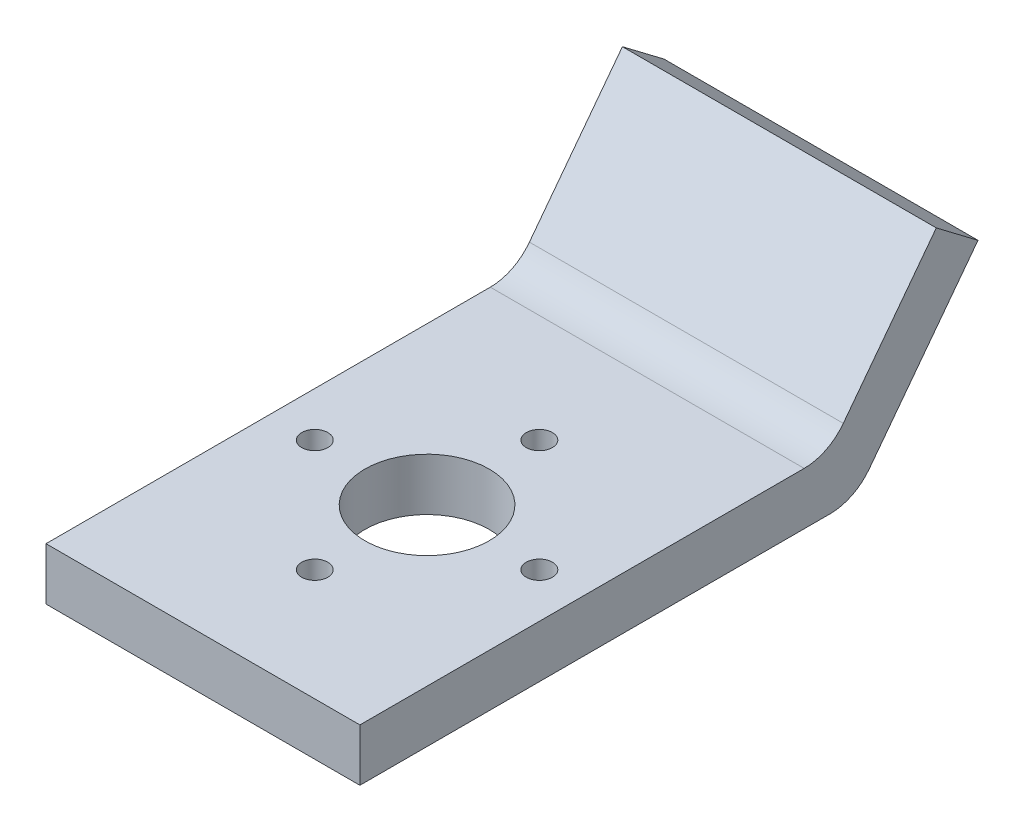
ISO-10303-21;
HEADER;
FILE_DESCRIPTION(('STEP AP214'),'2;1');
FILE_NAME('part.step','',(''),(''),'','','');
FILE_SCHEMA(('AUTOMOTIVE_DESIGN { 1 0 10303 214 1 1 1 1 }'));
ENDSEC;
DATA;
#1=APPLICATION_CONTEXT('core data for automotive mechanical design processes');
#2=APPLICATION_PROTOCOL_DEFINITION('international standard','automotive_design',2000,#1);
#3=PRODUCT_CONTEXT('',#1,'mechanical');
#4=PRODUCT('Part','Part','',(#3));
#5=PRODUCT_RELATED_PRODUCT_CATEGORY('part','',(#4));
#6=PRODUCT_DEFINITION_FORMATION('','',#4);
#7=PRODUCT_DEFINITION_CONTEXT('part definition',#1,'design');
#8=PRODUCT_DEFINITION('design','',#6,#7);
#9=PRODUCT_DEFINITION_SHAPE('','',#8);
#10=(LENGTH_UNIT() NAMED_UNIT(*) SI_UNIT(.MILLI.,.METRE.));
#11=(NAMED_UNIT(*) PLANE_ANGLE_UNIT() SI_UNIT($,.RADIAN.));
#12=(NAMED_UNIT(*) SI_UNIT($,.STERADIAN.) SOLID_ANGLE_UNIT());
#13=UNCERTAINTY_MEASURE_WITH_UNIT(LENGTH_MEASURE(1.E-05),#10,'distance_accuracy_value','');
#14=(GEOMETRIC_REPRESENTATION_CONTEXT(3) GLOBAL_UNCERTAINTY_ASSIGNED_CONTEXT((#13)) GLOBAL_UNIT_ASSIGNED_CONTEXT((#10,
#11,#12)) REPRESENTATION_CONTEXT('',''));
#15=CARTESIAN_POINT('',(0.,0.,0.));
#16=DIRECTION('',(0.,0.,1.));
#17=DIRECTION('',(1.,0.,0.));
#18=AXIS2_PLACEMENT_3D('',#15,#16,#17);
#19=CARTESIAN_POINT('',(-38.1,28.9394708532665,-34.0237396964989));
#20=DIRECTION('',(0.,-1.,0.));
#21=DIRECTION('',(0.,0.,-1.));
#22=AXIS2_PLACEMENT_3D('',#19,#20,#21);
#23=PLANE('',#22);
#24=CARTESIAN_POINT('',(-5.42234568987325,28.9394708532665,-61.2250075726712));
#25=DIRECTION('',(0.,-1.,0.));
#26=DIRECTION('',(0.,0.,-1.));
#27=AXIS2_PLACEMENT_3D('',#24,#25,#26);
#28=CIRCLE('',#27,1.58694807587819);
#29=CARTESIAN_POINT('',(-5.42234568987325,28.9394708532665,-62.8119556485494));
#30=VERTEX_POINT('',#29);
#31=EDGE_CURVE('E172',#30,#30,#28,.F.);
#32=ORIENTED_EDGE('',*,*,#31,.T.);
#33=EDGE_LOOP('',(#32));
#34=FACE_BOUND('',#33,.T.);
#35=CARTESIAN_POINT('',(-32.6776543101267,28.9394708532665,-61.2250075726712));
#36=DIRECTION('',(0.,-1.,0.));
#37=DIRECTION('',(0.,0.,-1.));
#38=AXIS2_PLACEMENT_3D('',#35,#36,#37);
#39=CIRCLE('',#38,1.5869480758782);
#40=CARTESIAN_POINT('',(-32.6776543101267,28.9394708532665,-62.8119556485494));
#41=VERTEX_POINT('',#40);
#42=EDGE_CURVE('E165',#41,#41,#39,.F.);
#43=ORIENTED_EDGE('',*,*,#42,.T.);
#44=EDGE_LOOP('',(#43));
#45=FACE_BOUND('',#44,.T.);
#46=DIRECTION('',(0.,0.,-1.));
#47=VECTOR('',#46,1.);
#48=CARTESIAN_POINT('',(0.,28.9394708532665,-34.0237396964989));
#49=LINE('',#48,#47);
#50=CARTESIAN_POINT('',(0.,28.9394708532665,-34.0237396964989));
#51=VERTEX_POINT('',#50);
#52=CARTESIAN_POINT('',(0.,28.9394708532665,-91.1074885716545));
#53=VERTEX_POINT('',#52);
#54=EDGE_CURVE('E146',#51,#53,#49,.T.);
#55=ORIENTED_EDGE('',*,*,#54,.F.);
#56=DIRECTION('',(1.,0.,0.));
#57=VECTOR('',#56,1.);
#58=CARTESIAN_POINT('',(-38.1,28.9394708532665,-34.0237396964989));
#59=LINE('',#58,#57);
#60=CARTESIAN_POINT('',(-38.1,28.9394708532665,-34.0237396964989));
#61=VERTEX_POINT('',#60);
#62=EDGE_CURVE('E112',#61,#51,#59,.T.);
#63=ORIENTED_EDGE('',*,*,#62,.F.);
#64=DIRECTION('',(0.,0.,-1.));
#65=VECTOR('',#64,1.);
#66=CARTESIAN_POINT('',(-38.1,28.9394708532665,-34.0237396964989));
#67=LINE('',#66,#65);
#68=CARTESIAN_POINT('',(-38.1,28.9394708532665,-91.1074885716545));
#69=VERTEX_POINT('',#68);
#70=EDGE_CURVE('E118',#61,#69,#67,.T.);
#71=ORIENTED_EDGE('',*,*,#70,.T.);
#72=DIRECTION('',(1.,0.,0.));
#73=VECTOR('',#72,1.);
#74=CARTESIAN_POINT('',(-38.1,28.9394708532665,-91.1074885716545));
#75=LINE('',#74,#73);
#76=EDGE_CURVE('E102',#69,#53,#75,.T.);
#77=ORIENTED_EDGE('',*,*,#76,.T.);
#78=EDGE_LOOP('',(#55,#63,#71,#77));
#79=FACE_BOUND('',#78,.T.);
#80=CARTESIAN_POINT('',(-19.05,28.9394708532665,-61.2250075726712));
#81=DIRECTION('',(0.,-1.,0.));
#82=DIRECTION('',(0.,0.,-1.));
#83=AXIS2_PLACEMENT_3D('',#80,#81,#82);
#84=CIRCLE('',#83,7.54356303083551);
#85=CARTESIAN_POINT('',(-19.05,28.9394708532665,-68.7685706035067));
#86=VERTEX_POINT('',#85);
#87=EDGE_CURVE('E134',#86,#86,#84,.F.);
#88=ORIENTED_EDGE('',*,*,#87,.T.);
#89=EDGE_LOOP('',(#88));
#90=FACE_BOUND('',#89,.T.);
#91=CARTESIAN_POINT('',(-19.05,28.9394708532665,-74.8526618827979));
#92=DIRECTION('',(0.,-1.,0.));
#93=DIRECTION('',(0.,0.,-1.));
#94=AXIS2_PLACEMENT_3D('',#91,#92,#93);
#95=CIRCLE('',#94,1.5869480758782);
#96=CARTESIAN_POINT('',(-19.05,28.9394708532665,-76.4396099586761));
#97=VERTEX_POINT('',#96);
#98=EDGE_CURVE('E169',#97,#97,#95,.F.);
#99=ORIENTED_EDGE('',*,*,#98,.T.);
#100=EDGE_LOOP('',(#99));
#101=FACE_BOUND('',#100,.T.);
#102=CARTESIAN_POINT('',(-19.05,28.9394708532665,-47.5973532625444));
#103=DIRECTION('',(0.,-1.,0.));
#104=DIRECTION('',(0.,0.,-1.));
#105=AXIS2_PLACEMENT_3D('',#102,#103,#104);
#106=CIRCLE('',#105,1.5869480758782);
#107=CARTESIAN_POINT('',(-19.05,28.9394708532665,-49.1843013384226));
#108=VERTEX_POINT('',#107);
#109=EDGE_CURVE('E175',#108,#108,#106,.F.);
#110=ORIENTED_EDGE('',*,*,#109,.T.);
#111=EDGE_LOOP('',(#110));
#112=FACE_BOUND('',#111,.T.);
#113=ADVANCED_FACE('F31',(#34,#45,#79,#90,#101,#112),#23,.T.);
#114=CARTESIAN_POINT('',(-38.1,35.2894708532665,-34.0237396964989));
#115=DIRECTION('',(0.,1.,0.));
#116=DIRECTION('',(0.,0.,1.));
#117=AXIS2_PLACEMENT_3D('',#114,#115,#116);
#118=PLANE('',#117);
#119=CARTESIAN_POINT('',(-5.42234568987325,35.2894708532665,-61.2250075726712));
#120=DIRECTION('',(0.,1.,0.));
#121=DIRECTION('',(0.,0.,1.));
#122=AXIS2_PLACEMENT_3D('',#119,#120,#121);
#123=CIRCLE('',#122,1.58694807587819);
#124=CARTESIAN_POINT('',(-5.42234568987325,35.2894708532665,-62.8119556485494));
#125=VERTEX_POINT('',#124);
#126=EDGE_CURVE('E173',#125,#125,#123,.F.);
#127=ORIENTED_EDGE('',*,*,#126,.T.);
#128=EDGE_LOOP('',(#127));
#129=FACE_BOUND('',#128,.T.);
#130=CARTESIAN_POINT('',(-32.6776543101267,35.2894708532665,-61.2250075726712));
#131=DIRECTION('',(0.,1.,0.));
#132=DIRECTION('',(0.,0.,1.));
#133=AXIS2_PLACEMENT_3D('',#130,#131,#132);
#134=CIRCLE('',#133,1.5869480758782);
#135=CARTESIAN_POINT('',(-32.6776543101267,35.2894708532665,-62.8119556485494));
#136=VERTEX_POINT('',#135);
#137=EDGE_CURVE('E166',#136,#136,#134,.F.);
#138=ORIENTED_EDGE('',*,*,#137,.T.);
#139=EDGE_LOOP('',(#138));
#140=FACE_BOUND('',#139,.T.);
#141=DIRECTION('',(0.,0.,1.));
#142=VECTOR('',#141,1.);
#143=CARTESIAN_POINT('',(0.,35.2894708532665,-34.0237396964989));
#144=LINE('',#143,#142);
#145=CARTESIAN_POINT('',(0.,35.2894708532665,-87.9511869365552));
#146=VERTEX_POINT('',#145);
#147=CARTESIAN_POINT('',(0.,35.2894708532665,-34.0237396964989));
#148=VERTEX_POINT('',#147);
#149=EDGE_CURVE('E140',#146,#148,#144,.T.);
#150=ORIENTED_EDGE('',*,*,#149,.F.);
#151=DIRECTION('',(1.,0.,0.));
#152=VECTOR('',#151,1.);
#153=CARTESIAN_POINT('',(-38.1,35.2894708532665,-87.9511869365552));
#154=LINE('',#153,#152);
#155=CARTESIAN_POINT('',(-38.1,35.2894708532665,-87.9511869365552));
#156=VERTEX_POINT('',#155);
#157=EDGE_CURVE('E157',#156,#146,#154,.T.);
#158=ORIENTED_EDGE('',*,*,#157,.F.);
#159=DIRECTION('',(0.,0.,1.));
#160=VECTOR('',#159,1.);
#161=CARTESIAN_POINT('',(-38.1,35.2894708532665,-34.0237396964989));
#162=LINE('',#161,#160);
#163=CARTESIAN_POINT('',(-38.1,35.2894708532665,-34.0237396964989));
#164=VERTEX_POINT('',#163);
#165=EDGE_CURVE('E125',#156,#164,#162,.T.);
#166=ORIENTED_EDGE('',*,*,#165,.T.);
#167=DIRECTION('',(1.,0.,0.));
#168=VECTOR('',#167,1.);
#169=CARTESIAN_POINT('',(-38.1,35.2894708532665,-34.0237396964989));
#170=LINE('',#169,#168);
#171=EDGE_CURVE('E155',#164,#148,#170,.T.);
#172=ORIENTED_EDGE('',*,*,#171,.T.);
#173=EDGE_LOOP('',(#150,#158,#166,#172));
#174=FACE_BOUND('',#173,.T.);
#175=CARTESIAN_POINT('',(-19.05,35.2894708532665,-61.2250075726712));
#176=DIRECTION('',(0.,1.,0.));
#177=DIRECTION('',(0.,0.,1.));
#178=AXIS2_PLACEMENT_3D('',#175,#176,#177);
#179=CIRCLE('',#178,7.54356303083551);
#180=CARTESIAN_POINT('',(-19.05,35.2894708532665,-68.7685706035067));
#181=VERTEX_POINT('',#180);
#182=EDGE_CURVE('E162',#181,#181,#179,.F.);
#183=ORIENTED_EDGE('',*,*,#182,.T.);
#184=EDGE_LOOP('',(#183));
#185=FACE_BOUND('',#184,.T.);
#186=CARTESIAN_POINT('',(-19.05,35.2894708532665,-74.8526618827979));
#187=DIRECTION('',(0.,1.,0.));
#188=DIRECTION('',(0.,0.,1.));
#189=AXIS2_PLACEMENT_3D('',#186,#187,#188);
#190=CIRCLE('',#189,1.5869480758782);
#191=CARTESIAN_POINT('',(-19.05,35.2894708532665,-76.4396099586761));
#192=VERTEX_POINT('',#191);
#193=EDGE_CURVE('E170',#192,#192,#190,.F.);
#194=ORIENTED_EDGE('',*,*,#193,.T.);
#195=EDGE_LOOP('',(#194));
#196=FACE_BOUND('',#195,.T.);
#197=CARTESIAN_POINT('',(-19.05,35.2894708532665,-47.5973532625444));
#198=DIRECTION('',(0.,1.,0.));
#199=DIRECTION('',(0.,0.,1.));
#200=AXIS2_PLACEMENT_3D('',#197,#198,#199);
#201=CIRCLE('',#200,1.5869480758782);
#202=CARTESIAN_POINT('',(-19.05,35.2894708532665,-49.1843013384226));
#203=VERTEX_POINT('',#202);
#204=EDGE_CURVE('E35',#203,#203,#201,.F.);
#205=ORIENTED_EDGE('',*,*,#204,.T.);
#206=EDGE_LOOP('',(#205));
#207=FACE_BOUND('',#206,.T.);
#208=ADVANCED_FACE('F201',(#129,#140,#174,#185,#196,#207),#118,.T.);
#209=CARTESIAN_POINT('',(-38.1,48.7160753374682,-109.047015974455));
#210=DIRECTION('',(0.,0.797160942990067,-0.603766868063483));
#211=DIRECTION('',(0.,0.603766868063483,0.797160942990067));
#212=AXIS2_PLACEMENT_3D('',#209,#210,#211);
#213=PLANE('',#212);
#214=DIRECTION('',(0.,0.603766868063483,0.797160942990067));
#215=VECTOR('',#214,1.);
#216=CARTESIAN_POINT('',(0.,48.7160753374682,-109.047015974455));
#217=LINE('',#216,#215);
#218=CARTESIAN_POINT('',(0.,48.7160753374682,-109.047015974455));
#219=VERTEX_POINT('',#218);
#220=CARTESIAN_POINT('',(0.,52.5499949496713,-103.985043986468));
#221=VERTEX_POINT('',#220);
#222=EDGE_CURVE('E130',#219,#221,#217,.T.);
#223=ORIENTED_EDGE('',*,*,#222,.F.);
#224=DIRECTION('',(1.,0.,0.));
#225=VECTOR('',#224,1.);
#226=CARTESIAN_POINT('',(-38.1,48.7160753374682,-109.047015974455));
#227=LINE('',#226,#225);
#228=CARTESIAN_POINT('',(-38.1,48.7160753374682,-109.047015974455));
#229=VERTEX_POINT('',#228);
#230=EDGE_CURVE('E12',#229,#219,#227,.T.);
#231=ORIENTED_EDGE('',*,*,#230,.F.);
#232=DIRECTION('',(0.,0.603766868063483,0.797160942990067));
#233=VECTOR('',#232,1.);
#234=CARTESIAN_POINT('',(-38.1,48.7160753374682,-109.047015974455));
#235=LINE('',#234,#233);
#236=CARTESIAN_POINT('',(-38.1,52.5499949496713,-103.985043986468));
#237=VERTEX_POINT('',#236);
#238=EDGE_CURVE('E151',#229,#237,#235,.T.);
#239=ORIENTED_EDGE('',*,*,#238,.T.);
#240=DIRECTION('',(1.,0.,0.));
#241=VECTOR('',#240,1.);
#242=CARTESIAN_POINT('',(-38.1,52.5499949496713,-103.985043986468));
#243=LINE('',#242,#241);
#244=EDGE_CURVE('E88',#237,#221,#243,.T.);
#245=ORIENTED_EDGE('',*,*,#244,.T.);
#246=EDGE_LOOP('',(#223,#231,#239,#245));
#247=FACE_BOUND('',#246,.T.);
#248=ADVANCED_FACE('F33',(#247),#213,.T.);
#249=CARTESIAN_POINT('',(-38.1,31.2997028841221,-95.8559173115653));
#250=DIRECTION('',(0.,-0.603766868063483,-0.797160942990067));
#251=DIRECTION('',(0.,0.797160942990067,-0.603766868063483));
#252=AXIS2_PLACEMENT_3D('',#249,#250,#251);
#253=PLANE('',#252);
#254=DIRECTION('',(0.,0.797160942990067,-0.603766868063483));
#255=VECTOR('',#254,1.);
#256=CARTESIAN_POINT('',(0.,31.2997028841221,-95.8559173115653));
#257=LINE('',#256,#255);
#258=CARTESIAN_POINT('',(0.,31.2997028841221,-95.8559173115653));
#259=VERTEX_POINT('',#258);
#260=EDGE_CURVE('E149',#259,#219,#257,.T.);
#261=ORIENTED_EDGE('',*,*,#260,.F.);
#262=DIRECTION('',(1.,0.,0.));
#263=VECTOR('',#262,1.);
#264=CARTESIAN_POINT('',(-38.1,31.2997028841221,-95.8559173115653));
#265=LINE('',#264,#263);
#266=CARTESIAN_POINT('',(-38.1,31.2997028841221,-95.8559173115653));
#267=VERTEX_POINT('',#266);
#268=EDGE_CURVE('E41',#267,#259,#265,.T.);
#269=ORIENTED_EDGE('',*,*,#268,.F.);
#270=DIRECTION('',(0.,0.797160942990067,-0.603766868063483));
#271=VECTOR('',#270,1.);
#272=CARTESIAN_POINT('',(-38.1,31.2997028841221,-95.8559173115653));
#273=LINE('',#272,#271);
#274=EDGE_CURVE('E120',#267,#229,#273,.T.);
#275=ORIENTED_EDGE('',*,*,#274,.T.);
#276=ORIENTED_EDGE('',*,*,#230,.T.);
#277=EDGE_LOOP('',(#261,#269,#275,#276));
#278=FACE_BOUND('',#277,.T.);
#279=ADVANCED_FACE('F211',(#278),#253,.T.);
#280=CARTESIAN_POINT('',(-38.1,34.8961459534037,-91.1074885716545));
#281=DIRECTION('',(1.,0.,0.));
#282=DIRECTION('',(0.,0.,-1.));
#283=AXIS2_PLACEMENT_3D('',#280,#281,#282);
#284=CYLINDRICAL_SURFACE('',#283,5.9566751001372);
#285=CARTESIAN_POINT('',(0.,34.8961459534037,-91.1074885716545));
#286=DIRECTION('',(1.,0.,0.));
#287=DIRECTION('',(0.,0.,-1.));
#288=AXIS2_PLACEMENT_3D('',#285,#286,#287);
#289=CIRCLE('',#288,5.9566751001372);
#290=EDGE_CURVE('E107',#53,#259,#289,.T.);
#291=ORIENTED_EDGE('',*,*,#290,.F.);
#292=ORIENTED_EDGE('',*,*,#76,.F.);
#293=CARTESIAN_POINT('',(-38.1,34.8961459534037,-91.1074885716545));
#294=DIRECTION('',(1.,0.,0.));
#295=DIRECTION('',(0.,0.,-1.));
#296=AXIS2_PLACEMENT_3D('',#293,#294,#295);
#297=CIRCLE('',#296,5.9566751001372);
#298=EDGE_CURVE('E105',#69,#267,#297,.T.);
#299=ORIENTED_EDGE('',*,*,#298,.T.);
#300=ORIENTED_EDGE('',*,*,#268,.T.);
#301=EDGE_LOOP('',(#291,#292,#299,#300));
#302=FACE_BOUND('',#301,.T.);
#303=ADVANCED_FACE('F104',(#302),#284,.T.);
#304=CARTESIAN_POINT('',(-38.1,35.2894708532665,-34.0237396964989));
#305=DIRECTION('',(0.,0.,1.));
#306=DIRECTION('',(0.,-1.,0.));
#307=AXIS2_PLACEMENT_3D('',#304,#305,#306);
#308=PLANE('',#307);
#309=DIRECTION('',(0.,-1.,0.));
#310=VECTOR('',#309,1.);
#311=CARTESIAN_POINT('',(0.,35.2894708532665,-34.0237396964989));
#312=LINE('',#311,#310);
#313=EDGE_CURVE('E143',#148,#51,#312,.T.);
#314=ORIENTED_EDGE('',*,*,#313,.F.);
#315=ORIENTED_EDGE('',*,*,#171,.F.);
#316=DIRECTION('',(0.,-1.,0.));
#317=VECTOR('',#316,1.);
#318=CARTESIAN_POINT('',(-38.1,35.2894708532665,-34.0237396964989));
#319=LINE('',#318,#317);
#320=EDGE_CURVE('E123',#164,#61,#319,.T.);
#321=ORIENTED_EDGE('',*,*,#320,.T.);
#322=ORIENTED_EDGE('',*,*,#62,.T.);
#323=EDGE_LOOP('',(#314,#315,#321,#322));
#324=FACE_BOUND('',#323,.T.);
#325=ADVANCED_FACE('F218',(#324),#308,.T.);
#326=CARTESIAN_POINT('',(-38.1,41.2461459534037,-87.9511869365552));
#327=DIRECTION('',(1.,0.,0.));
#328=DIRECTION('',(0.,0.,-1.));
#329=AXIS2_PLACEMENT_3D('',#326,#327,#328);
#330=CYLINDRICAL_SURFACE('',#329,5.95667510013721);
#331=CARTESIAN_POINT('',(0.,41.2461459534037,-87.9511869365552));
#332=DIRECTION('',(-1.,0.,0.));
#333=DIRECTION('',(0.,0.,-1.));
#334=AXIS2_PLACEMENT_3D('',#331,#332,#333);
#335=CIRCLE('',#334,5.95667510013721);
#336=CARTESIAN_POINT('',(0.,37.6497028841221,-92.699615676466));
#337=VERTEX_POINT('',#336);
#338=EDGE_CURVE('E137',#337,#146,#335,.T.);
#339=ORIENTED_EDGE('',*,*,#338,.F.);
#340=DIRECTION('',(1.,0.,0.));
#341=VECTOR('',#340,1.);
#342=CARTESIAN_POINT('',(-38.1,37.6497028841221,-92.699615676466));
#343=LINE('',#342,#341);
#344=CARTESIAN_POINT('',(-38.1,37.6497028841221,-92.699615676466));
#345=VERTEX_POINT('',#344);
#346=EDGE_CURVE('E159',#345,#337,#343,.T.);
#347=ORIENTED_EDGE('',*,*,#346,.F.);
#348=CARTESIAN_POINT('',(-38.1,41.2461459534037,-87.9511869365552));
#349=DIRECTION('',(-1.,0.,0.));
#350=DIRECTION('',(0.,0.,-1.));
#351=AXIS2_PLACEMENT_3D('',#348,#349,#350);
#352=CIRCLE('',#351,5.95667510013721);
#353=EDGE_CURVE('E195',#345,#156,#352,.T.);
#354=ORIENTED_EDGE('',*,*,#353,.T.);
#355=ORIENTED_EDGE('',*,*,#157,.T.);
#356=EDGE_LOOP('',(#339,#347,#354,#355));
#357=FACE_BOUND('',#356,.T.);
#358=ADVANCED_FACE('F207',(#357),#330,.F.);
#359=CARTESIAN_POINT('',(-38.1,37.6497028841221,-92.699615676466));
#360=DIRECTION('',(0.,0.603766868063482,0.797160942990067));
#361=DIRECTION('',(0.,-0.797160942990067,0.603766868063482));
#362=AXIS2_PLACEMENT_3D('',#359,#360,#361);
#363=PLANE('',#362);
#364=DIRECTION('',(0.,-0.797160942990067,0.603766868063482));
#365=VECTOR('',#364,1.);
#366=CARTESIAN_POINT('',(0.,37.6497028841221,-92.699615676466));
#367=LINE('',#366,#365);
#368=EDGE_CURVE('E133',#221,#337,#367,.T.);
#369=ORIENTED_EDGE('',*,*,#368,.F.);
#370=ORIENTED_EDGE('',*,*,#244,.F.);
#371=DIRECTION('',(0.,-0.797160942990067,0.603766868063482));
#372=VECTOR('',#371,1.);
#373=CARTESIAN_POINT('',(-38.1,37.6497028841221,-92.699615676466));
#374=LINE('',#373,#372);
#375=EDGE_CURVE('E193',#237,#345,#374,.T.);
#376=ORIENTED_EDGE('',*,*,#375,.T.);
#377=ORIENTED_EDGE('',*,*,#346,.T.);
#378=EDGE_LOOP('',(#369,#370,#376,#377));
#379=FACE_BOUND('',#378,.T.);
#380=ADVANCED_FACE('F208',(#379),#363,.T.);
#381=CARTESIAN_POINT('',(-38.1,41.2461459534037,-87.9511869365552));
#382=DIRECTION('',(1.,0.,0.));
#383=DIRECTION('',(0.,0.,-1.));
#384=AXIS2_PLACEMENT_3D('',#381,#382,#383);
#385=PLANE('',#384);
#386=ORIENTED_EDGE('',*,*,#238,.F.);
#387=ORIENTED_EDGE('',*,*,#274,.F.);
#388=ORIENTED_EDGE('',*,*,#298,.F.);
#389=ORIENTED_EDGE('',*,*,#70,.F.);
#390=ORIENTED_EDGE('',*,*,#320,.F.);
#391=ORIENTED_EDGE('',*,*,#165,.F.);
#392=ORIENTED_EDGE('',*,*,#353,.F.);
#393=ORIENTED_EDGE('',*,*,#375,.F.);
#394=EDGE_LOOP('',(#386,#387,#388,#389,#390,#391,#392,#393));
#395=FACE_BOUND('',#394,.T.);
#396=ADVANCED_FACE('F116',(#395),#385,.F.);
#397=CARTESIAN_POINT('',(0.,41.2461459534037,-87.9511869365552));
#398=DIRECTION('',(1.,0.,0.));
#399=DIRECTION('',(0.,0.,-1.));
#400=AXIS2_PLACEMENT_3D('',#397,#398,#399);
#401=PLANE('',#400);
#402=ORIENTED_EDGE('',*,*,#222,.T.);
#403=ORIENTED_EDGE('',*,*,#368,.T.);
#404=ORIENTED_EDGE('',*,*,#338,.T.);
#405=ORIENTED_EDGE('',*,*,#149,.T.);
#406=ORIENTED_EDGE('',*,*,#313,.T.);
#407=ORIENTED_EDGE('',*,*,#54,.T.);
#408=ORIENTED_EDGE('',*,*,#290,.T.);
#409=ORIENTED_EDGE('',*,*,#260,.T.);
#410=EDGE_LOOP('',(#402,#403,#404,#405,#406,#407,#408,#409));
#411=FACE_BOUND('',#410,.T.);
#412=ADVANCED_FACE('F210',(#411),#401,.T.);
#413=CARTESIAN_POINT('',(-19.05,38.1,-61.2250075726712));
#414=DIRECTION('',(0.,-1.,0.));
#415=DIRECTION('',(0.,0.,-1.));
#416=AXIS2_PLACEMENT_3D('',#413,#414,#415);
#417=CYLINDRICAL_SURFACE('',#416,7.54356303083551);
#418=CARTESIAN_POINT('',(-19.05,28.9394708532665,-68.7685706035067));
#419=CARTESIAN_POINT('',(-19.05,29.0056166865998,-68.7685706035067));
#420=CARTESIAN_POINT('',(-19.05,29.0717625199332,-68.7685706035067));
#421=CARTESIAN_POINT('',(-19.05,29.2040541865998,-68.7685706035067));
#422=CARTESIAN_POINT('',(-19.05,29.2702000199332,-68.7685706035067));
#423=CARTESIAN_POINT('',(-19.05,29.4024916865998,-68.7685706035067));
#424=CARTESIAN_POINT('',(-19.05,29.4686375199332,-68.7685706035067));
#425=CARTESIAN_POINT('',(-19.05,29.6009291865998,-68.7685706035067));
#426=CARTESIAN_POINT('',(-19.05,29.6670750199332,-68.7685706035067));
#427=CARTESIAN_POINT('',(-19.05,29.7993666865998,-68.7685706035067));
#428=CARTESIAN_POINT('',(-19.05,29.8655125199332,-68.7685706035067));
#429=CARTESIAN_POINT('',(-19.05,29.9978041865998,-68.7685706035067));
#430=CARTESIAN_POINT('',(-19.05,30.0639500199332,-68.7685706035067));
#431=CARTESIAN_POINT('',(-19.05,30.1962416865998,-68.7685706035067));
#432=CARTESIAN_POINT('',(-19.05,30.2623875199332,-68.7685706035067));
#433=CARTESIAN_POINT('',(-19.05,30.3946791865998,-68.7685706035067));
#434=CARTESIAN_POINT('',(-19.05,30.4608250199332,-68.7685706035067));
#435=CARTESIAN_POINT('',(-19.05,30.5931166865998,-68.7685706035067));
#436=CARTESIAN_POINT('',(-19.05,30.6592625199332,-68.7685706035067));
#437=CARTESIAN_POINT('',(-19.05,30.7915541865998,-68.7685706035067));
#438=CARTESIAN_POINT('',(-19.05,30.8577000199332,-68.7685706035067));
#439=CARTESIAN_POINT('',(-19.05,30.9899916865998,-68.7685706035067));
#440=CARTESIAN_POINT('',(-19.05,31.0561375199332,-68.7685706035067));
#441=CARTESIAN_POINT('',(-19.05,31.1884291865998,-68.7685706035067));
#442=CARTESIAN_POINT('',(-19.05,31.2545750199332,-68.7685706035067));
#443=CARTESIAN_POINT('',(-19.05,31.3868666865998,-68.7685706035067));
#444=CARTESIAN_POINT('',(-19.05,31.4530125199332,-68.7685706035067));
#445=CARTESIAN_POINT('',(-19.05,31.5853041865998,-68.7685706035067));
#446=CARTESIAN_POINT('',(-19.05,31.6514500199332,-68.7685706035067));
#447=CARTESIAN_POINT('',(-19.05,31.7837416865998,-68.7685706035067));
#448=CARTESIAN_POINT('',(-19.05,31.8498875199332,-68.7685706035067));
#449=CARTESIAN_POINT('',(-19.05,31.9821791865998,-68.7685706035067));
#450=CARTESIAN_POINT('',(-19.05,32.0483250199332,-68.7685706035067));
#451=CARTESIAN_POINT('',(-19.05,32.1806166865998,-68.7685706035067));
#452=CARTESIAN_POINT('',(-19.05,32.2467625199332,-68.7685706035067));
#453=CARTESIAN_POINT('',(-19.05,32.3790541865998,-68.7685706035067));
#454=CARTESIAN_POINT('',(-19.05,32.4452000199332,-68.7685706035067));
#455=CARTESIAN_POINT('',(-19.05,32.5774916865998,-68.7685706035067));
#456=CARTESIAN_POINT('',(-19.05,32.6436375199332,-68.7685706035067));
#457=CARTESIAN_POINT('',(-19.05,32.7759291865998,-68.7685706035067));
#458=CARTESIAN_POINT('',(-19.05,32.8420750199332,-68.7685706035067));
#459=CARTESIAN_POINT('',(-19.05,32.9743666865998,-68.7685706035067));
#460=CARTESIAN_POINT('',(-19.05,33.0405125199332,-68.7685706035067));
#461=CARTESIAN_POINT('',(-19.05,33.1728041865998,-68.7685706035067));
#462=CARTESIAN_POINT('',(-19.05,33.2389500199332,-68.7685706035067));
#463=CARTESIAN_POINT('',(-19.05,33.3712416865998,-68.7685706035067));
#464=CARTESIAN_POINT('',(-19.05,33.4373875199332,-68.7685706035067));
#465=CARTESIAN_POINT('',(-19.05,33.5696791865998,-68.7685706035067));
#466=CARTESIAN_POINT('',(-19.05,33.6358250199332,-68.7685706035067));
#467=CARTESIAN_POINT('',(-19.05,33.7681166865998,-68.7685706035067));
#468=CARTESIAN_POINT('',(-19.05,33.8342625199332,-68.7685706035067));
#469=CARTESIAN_POINT('',(-19.05,33.9665541865998,-68.7685706035067));
#470=CARTESIAN_POINT('',(-19.05,34.0327000199332,-68.7685706035067));
#471=CARTESIAN_POINT('',(-19.05,34.1649916865998,-68.7685706035067));
#472=CARTESIAN_POINT('',(-19.05,34.2311375199332,-68.7685706035067));
#473=CARTESIAN_POINT('',(-19.05,34.3634291865998,-68.7685706035067));
#474=CARTESIAN_POINT('',(-19.05,34.4295750199332,-68.7685706035067));
#475=CARTESIAN_POINT('',(-19.05,34.5618666865998,-68.7685706035067));
#476=CARTESIAN_POINT('',(-19.05,34.6280125199332,-68.7685706035067));
#477=CARTESIAN_POINT('',(-19.05,34.7603041865998,-68.7685706035067));
#478=CARTESIAN_POINT('',(-19.05,34.8264500199332,-68.7685706035067));
#479=CARTESIAN_POINT('',(-19.05,34.9587416865998,-68.7685706035067));
#480=CARTESIAN_POINT('',(-19.05,35.0248875199332,-68.7685706035067));
#481=CARTESIAN_POINT('',(-19.05,35.1571791865998,-68.7685706035067));
#482=CARTESIAN_POINT('',(-19.05,35.2233250199332,-68.7685706035067));
#483=CARTESIAN_POINT('',(-19.05,35.2894708532665,-68.7685706035067));
#484=B_SPLINE_CURVE_WITH_KNOTS('',3,(#418,#419,#420,#421,#422,#423,#424,#425,#426,#427,#428,
#429,#430,#431,#432,#433,#434,#435,#436,#437,#438,#439,#440,#441,#442,#443,#444,#445,#446,#447,
#448,#449,#450,#451,#452,#453,#454,#455,#456,#457,#458,#459,#460,#461,#462,#463,#464,#465,#466,
#467,#468,#469,#470,#471,#472,#473,#474,#475,#476,#477,#478,#479,#480,#481,#482,#483),
.UNSPECIFIED.,.F.,.F.,(4,2,2,2,2,2,2,2,2,2,2,2,2,2,2,2,2,2,2,2,2,2,2,2,2,2,2,2,2,2,2,2,4),(0.,
0.198437500000002,0.396875000000001,0.5953125,0.793750000000003,0.992187500000002,1.190625,
1.3890625,1.5875,1.7859375,1.984375,2.1828125,2.38125,2.5796875,2.778125,2.9765625,3.175,
3.3734375,3.571875,3.7703125,3.96875,4.1671875,4.365625,4.5640625,4.7625,4.9609375,5.159375,
5.3578125,5.55625,5.7546875,5.953125,6.1515625,6.35),.UNSPECIFIED.);
#485=EDGE_CURVE('BSEAM242',#86,#181,#484,.T.);
#486=ORIENTED_EDGE('',*,*,#87,.F.);
#487=ORIENTED_EDGE('',*,*,#182,.F.);
#488=ORIENTED_EDGE('',*,*,#485,.T.);
#489=ORIENTED_EDGE('',*,*,#485,.F.);
#490=EDGE_LOOP('',(#486,#488,#487,#489));
#491=FACE_BOUND('',#490,.T.);
#492=ADVANCED_FACE('F242',(#491),#417,.F.);
#493=CARTESIAN_POINT('',(-32.6776543101267,38.1,-61.2250075726712));
#494=DIRECTION('',(0.,-1.,0.));
#495=DIRECTION('',(0.,0.,-1.));
#496=AXIS2_PLACEMENT_3D('',#493,#494,#495);
#497=CYLINDRICAL_SURFACE('',#496,1.5869480758782);
#498=CARTESIAN_POINT('',(-32.6776543101267,28.9394708532665,-62.8119556485494));
#499=CARTESIAN_POINT('',(-32.6776543101267,29.0056166865998,-62.8119556485494));
#500=CARTESIAN_POINT('',(-32.6776543101267,29.0717625199332,-62.8119556485494));
#501=CARTESIAN_POINT('',(-32.6776543101267,29.2040541865998,-62.8119556485494));
#502=CARTESIAN_POINT('',(-32.6776543101267,29.2702000199332,-62.8119556485494));
#503=CARTESIAN_POINT('',(-32.6776543101267,29.4024916865998,-62.8119556485494));
#504=CARTESIAN_POINT('',(-32.6776543101267,29.4686375199332,-62.8119556485494));
#505=CARTESIAN_POINT('',(-32.6776543101267,29.6009291865998,-62.8119556485494));
#506=CARTESIAN_POINT('',(-32.6776543101267,29.6670750199332,-62.8119556485494));
#507=CARTESIAN_POINT('',(-32.6776543101267,29.7993666865998,-62.8119556485494));
#508=CARTESIAN_POINT('',(-32.6776543101267,29.8655125199332,-62.8119556485494));
#509=CARTESIAN_POINT('',(-32.6776543101267,29.9978041865998,-62.8119556485494));
#510=CARTESIAN_POINT('',(-32.6776543101267,30.0639500199332,-62.8119556485494));
#511=CARTESIAN_POINT('',(-32.6776543101267,30.1962416865998,-62.8119556485494));
#512=CARTESIAN_POINT('',(-32.6776543101267,30.2623875199332,-62.8119556485494));
#513=CARTESIAN_POINT('',(-32.6776543101267,30.3946791865998,-62.8119556485494));
#514=CARTESIAN_POINT('',(-32.6776543101267,30.4608250199332,-62.8119556485494));
#515=CARTESIAN_POINT('',(-32.6776543101267,30.5931166865998,-62.8119556485494));
#516=CARTESIAN_POINT('',(-32.6776543101267,30.6592625199332,-62.8119556485494));
#517=CARTESIAN_POINT('',(-32.6776543101267,30.7915541865998,-62.8119556485494));
#518=CARTESIAN_POINT('',(-32.6776543101267,30.8577000199332,-62.8119556485494));
#519=CARTESIAN_POINT('',(-32.6776543101267,30.9899916865998,-62.8119556485494));
#520=CARTESIAN_POINT('',(-32.6776543101267,31.0561375199332,-62.8119556485494));
#521=CARTESIAN_POINT('',(-32.6776543101267,31.1884291865998,-62.8119556485494));
#522=CARTESIAN_POINT('',(-32.6776543101267,31.2545750199332,-62.8119556485494));
#523=CARTESIAN_POINT('',(-32.6776543101267,31.3868666865998,-62.8119556485494));
#524=CARTESIAN_POINT('',(-32.6776543101267,31.4530125199332,-62.8119556485494));
#525=CARTESIAN_POINT('',(-32.6776543101267,31.5853041865998,-62.8119556485494));
#526=CARTESIAN_POINT('',(-32.6776543101267,31.6514500199332,-62.8119556485494));
#527=CARTESIAN_POINT('',(-32.6776543101267,31.7837416865998,-62.8119556485494));
#528=CARTESIAN_POINT('',(-32.6776543101267,31.8498875199332,-62.8119556485494));
#529=CARTESIAN_POINT('',(-32.6776543101267,31.9821791865998,-62.8119556485494));
#530=CARTESIAN_POINT('',(-32.6776543101267,32.0483250199332,-62.8119556485494));
#531=CARTESIAN_POINT('',(-32.6776543101267,32.1806166865998,-62.8119556485494));
#532=CARTESIAN_POINT('',(-32.6776543101267,32.2467625199332,-62.8119556485494));
#533=CARTESIAN_POINT('',(-32.6776543101267,32.3790541865998,-62.8119556485494));
#534=CARTESIAN_POINT('',(-32.6776543101267,32.4452000199332,-62.8119556485494));
#535=CARTESIAN_POINT('',(-32.6776543101267,32.5774916865998,-62.8119556485494));
#536=CARTESIAN_POINT('',(-32.6776543101267,32.6436375199332,-62.8119556485494));
#537=CARTESIAN_POINT('',(-32.6776543101267,32.7759291865998,-62.8119556485494));
#538=CARTESIAN_POINT('',(-32.6776543101267,32.8420750199332,-62.8119556485494));
#539=CARTESIAN_POINT('',(-32.6776543101267,32.9743666865998,-62.8119556485494));
#540=CARTESIAN_POINT('',(-32.6776543101267,33.0405125199332,-62.8119556485494));
#541=CARTESIAN_POINT('',(-32.6776543101267,33.1728041865998,-62.8119556485494));
#542=CARTESIAN_POINT('',(-32.6776543101267,33.2389500199332,-62.8119556485494));
#543=CARTESIAN_POINT('',(-32.6776543101267,33.3712416865998,-62.8119556485494));
#544=CARTESIAN_POINT('',(-32.6776543101267,33.4373875199332,-62.8119556485494));
#545=CARTESIAN_POINT('',(-32.6776543101267,33.5696791865998,-62.8119556485494));
#546=CARTESIAN_POINT('',(-32.6776543101267,33.6358250199332,-62.8119556485494));
#547=CARTESIAN_POINT('',(-32.6776543101267,33.7681166865998,-62.8119556485494));
#548=CARTESIAN_POINT('',(-32.6776543101267,33.8342625199332,-62.8119556485494));
#549=CARTESIAN_POINT('',(-32.6776543101267,33.9665541865998,-62.8119556485494));
#550=CARTESIAN_POINT('',(-32.6776543101267,34.0327000199332,-62.8119556485494));
#551=CARTESIAN_POINT('',(-32.6776543101267,34.1649916865998,-62.8119556485494));
#552=CARTESIAN_POINT('',(-32.6776543101267,34.2311375199332,-62.8119556485494));
#553=CARTESIAN_POINT('',(-32.6776543101267,34.3634291865998,-62.8119556485494));
#554=CARTESIAN_POINT('',(-32.6776543101267,34.4295750199332,-62.8119556485494));
#555=CARTESIAN_POINT('',(-32.6776543101267,34.5618666865998,-62.8119556485494));
#556=CARTESIAN_POINT('',(-32.6776543101267,34.6280125199332,-62.8119556485494));
#557=CARTESIAN_POINT('',(-32.6776543101267,34.7603041865998,-62.8119556485494));
#558=CARTESIAN_POINT('',(-32.6776543101267,34.8264500199332,-62.8119556485494));
#559=CARTESIAN_POINT('',(-32.6776543101267,34.9587416865998,-62.8119556485494));
#560=CARTESIAN_POINT('',(-32.6776543101267,35.0248875199332,-62.8119556485494));
#561=CARTESIAN_POINT('',(-32.6776543101267,35.1571791865998,-62.8119556485494));
#562=CARTESIAN_POINT('',(-32.6776543101267,35.2233250199332,-62.8119556485494));
#563=CARTESIAN_POINT('',(-32.6776543101267,35.2894708532665,-62.8119556485494));
#564=B_SPLINE_CURVE_WITH_KNOTS('',3,(#498,#499,#500,#501,#502,#503,#504,#505,#506,#507,#508,
#509,#510,#511,#512,#513,#514,#515,#516,#517,#518,#519,#520,#521,#522,#523,#524,#525,#526,#527,
#528,#529,#530,#531,#532,#533,#534,#535,#536,#537,#538,#539,#540,#541,#542,#543,#544,#545,#546,
#547,#548,#549,#550,#551,#552,#553,#554,#555,#556,#557,#558,#559,#560,#561,#562,#563),
.UNSPECIFIED.,.F.,.F.,(4,2,2,2,2,2,2,2,2,2,2,2,2,2,2,2,2,2,2,2,2,2,2,2,2,2,2,2,2,2,2,2,4),(0.,
0.198437500000002,0.396875000000001,0.5953125,0.793750000000003,0.992187500000002,1.190625,
1.3890625,1.5875,1.7859375,1.984375,2.1828125,2.38125,2.5796875,2.778125,2.9765625,3.175,
3.3734375,3.571875,3.7703125,3.96875,4.1671875,4.365625,4.5640625,4.7625,4.9609375,5.159375,
5.3578125,5.55625,5.7546875,5.953125,6.1515625,6.35),.UNSPECIFIED.);
#565=EDGE_CURVE('BSEAM246',#41,#136,#564,.T.);
#566=ORIENTED_EDGE('',*,*,#42,.F.);
#567=ORIENTED_EDGE('',*,*,#137,.F.);
#568=ORIENTED_EDGE('',*,*,#565,.T.);
#569=ORIENTED_EDGE('',*,*,#565,.F.);
#570=EDGE_LOOP('',(#566,#568,#567,#569));
#571=FACE_BOUND('',#570,.T.);
#572=ADVANCED_FACE('F246',(#571),#497,.F.);
#573=CARTESIAN_POINT('',(-19.05,38.1,-74.8526618827979));
#574=DIRECTION('',(0.,-1.,0.));
#575=DIRECTION('',(0.,0.,-1.));
#576=AXIS2_PLACEMENT_3D('',#573,#574,#575);
#577=CYLINDRICAL_SURFACE('',#576,1.5869480758782);
#578=CARTESIAN_POINT('',(-19.05,28.9394708532665,-76.4396099586761));
#579=CARTESIAN_POINT('',(-19.05,29.0056166865998,-76.4396099586761));
#580=CARTESIAN_POINT('',(-19.05,29.0717625199332,-76.4396099586761));
#581=CARTESIAN_POINT('',(-19.05,29.2040541865998,-76.4396099586761));
#582=CARTESIAN_POINT('',(-19.05,29.2702000199332,-76.4396099586761));
#583=CARTESIAN_POINT('',(-19.05,29.4024916865998,-76.4396099586761));
#584=CARTESIAN_POINT('',(-19.05,29.4686375199332,-76.4396099586761));
#585=CARTESIAN_POINT('',(-19.05,29.6009291865998,-76.4396099586761));
#586=CARTESIAN_POINT('',(-19.05,29.6670750199332,-76.4396099586761));
#587=CARTESIAN_POINT('',(-19.05,29.7993666865998,-76.4396099586761));
#588=CARTESIAN_POINT('',(-19.05,29.8655125199332,-76.4396099586761));
#589=CARTESIAN_POINT('',(-19.05,29.9978041865998,-76.4396099586761));
#590=CARTESIAN_POINT('',(-19.05,30.0639500199332,-76.4396099586761));
#591=CARTESIAN_POINT('',(-19.05,30.1962416865998,-76.4396099586761));
#592=CARTESIAN_POINT('',(-19.05,30.2623875199332,-76.4396099586761));
#593=CARTESIAN_POINT('',(-19.05,30.3946791865998,-76.4396099586761));
#594=CARTESIAN_POINT('',(-19.05,30.4608250199332,-76.4396099586761));
#595=CARTESIAN_POINT('',(-19.05,30.5931166865998,-76.4396099586761));
#596=CARTESIAN_POINT('',(-19.05,30.6592625199332,-76.4396099586761));
#597=CARTESIAN_POINT('',(-19.05,30.7915541865998,-76.4396099586761));
#598=CARTESIAN_POINT('',(-19.05,30.8577000199332,-76.4396099586761));
#599=CARTESIAN_POINT('',(-19.05,30.9899916865998,-76.4396099586761));
#600=CARTESIAN_POINT('',(-19.05,31.0561375199332,-76.4396099586761));
#601=CARTESIAN_POINT('',(-19.05,31.1884291865998,-76.4396099586761));
#602=CARTESIAN_POINT('',(-19.05,31.2545750199332,-76.4396099586761));
#603=CARTESIAN_POINT('',(-19.05,31.3868666865998,-76.4396099586761));
#604=CARTESIAN_POINT('',(-19.05,31.4530125199332,-76.4396099586761));
#605=CARTESIAN_POINT('',(-19.05,31.5853041865998,-76.4396099586761));
#606=CARTESIAN_POINT('',(-19.05,31.6514500199332,-76.4396099586761));
#607=CARTESIAN_POINT('',(-19.05,31.7837416865998,-76.4396099586761));
#608=CARTESIAN_POINT('',(-19.05,31.8498875199332,-76.4396099586761));
#609=CARTESIAN_POINT('',(-19.05,31.9821791865998,-76.4396099586761));
#610=CARTESIAN_POINT('',(-19.05,32.0483250199332,-76.4396099586761));
#611=CARTESIAN_POINT('',(-19.05,32.1806166865998,-76.4396099586761));
#612=CARTESIAN_POINT('',(-19.05,32.2467625199332,-76.4396099586761));
#613=CARTESIAN_POINT('',(-19.05,32.3790541865998,-76.4396099586761));
#614=CARTESIAN_POINT('',(-19.05,32.4452000199332,-76.4396099586761));
#615=CARTESIAN_POINT('',(-19.05,32.5774916865998,-76.4396099586761));
#616=CARTESIAN_POINT('',(-19.05,32.6436375199332,-76.4396099586761));
#617=CARTESIAN_POINT('',(-19.05,32.7759291865998,-76.4396099586761));
#618=CARTESIAN_POINT('',(-19.05,32.8420750199332,-76.4396099586761));
#619=CARTESIAN_POINT('',(-19.05,32.9743666865998,-76.4396099586761));
#620=CARTESIAN_POINT('',(-19.05,33.0405125199332,-76.4396099586761));
#621=CARTESIAN_POINT('',(-19.05,33.1728041865998,-76.4396099586761));
#622=CARTESIAN_POINT('',(-19.05,33.2389500199332,-76.4396099586761));
#623=CARTESIAN_POINT('',(-19.05,33.3712416865998,-76.4396099586761));
#624=CARTESIAN_POINT('',(-19.05,33.4373875199332,-76.4396099586761));
#625=CARTESIAN_POINT('',(-19.05,33.5696791865998,-76.4396099586761));
#626=CARTESIAN_POINT('',(-19.05,33.6358250199332,-76.4396099586761));
#627=CARTESIAN_POINT('',(-19.05,33.7681166865998,-76.4396099586761));
#628=CARTESIAN_POINT('',(-19.05,33.8342625199332,-76.4396099586761));
#629=CARTESIAN_POINT('',(-19.05,33.9665541865998,-76.4396099586761));
#630=CARTESIAN_POINT('',(-19.05,34.0327000199332,-76.4396099586761));
#631=CARTESIAN_POINT('',(-19.05,34.1649916865998,-76.4396099586761));
#632=CARTESIAN_POINT('',(-19.05,34.2311375199332,-76.4396099586761));
#633=CARTESIAN_POINT('',(-19.05,34.3634291865998,-76.4396099586761));
#634=CARTESIAN_POINT('',(-19.05,34.4295750199332,-76.4396099586761));
#635=CARTESIAN_POINT('',(-19.05,34.5618666865998,-76.4396099586761));
#636=CARTESIAN_POINT('',(-19.05,34.6280125199332,-76.4396099586761));
#637=CARTESIAN_POINT('',(-19.05,34.7603041865998,-76.4396099586761));
#638=CARTESIAN_POINT('',(-19.05,34.8264500199332,-76.4396099586761));
#639=CARTESIAN_POINT('',(-19.05,34.9587416865998,-76.4396099586761));
#640=CARTESIAN_POINT('',(-19.05,35.0248875199332,-76.4396099586761));
#641=CARTESIAN_POINT('',(-19.05,35.1571791865998,-76.4396099586761));
#642=CARTESIAN_POINT('',(-19.05,35.2233250199332,-76.4396099586761));
#643=CARTESIAN_POINT('',(-19.05,35.2894708532665,-76.4396099586761));
#644=B_SPLINE_CURVE_WITH_KNOTS('',3,(#578,#579,#580,#581,#582,#583,#584,#585,#586,#587,#588,
#589,#590,#591,#592,#593,#594,#595,#596,#597,#598,#599,#600,#601,#602,#603,#604,#605,#606,#607,
#608,#609,#610,#611,#612,#613,#614,#615,#616,#617,#618,#619,#620,#621,#622,#623,#624,#625,#626,
#627,#628,#629,#630,#631,#632,#633,#634,#635,#636,#637,#638,#639,#640,#641,#642,#643),
.UNSPECIFIED.,.F.,.F.,(4,2,2,2,2,2,2,2,2,2,2,2,2,2,2,2,2,2,2,2,2,2,2,2,2,2,2,2,2,2,2,2,4),(0.,
0.198437500000002,0.396875000000001,0.5953125,0.793750000000003,0.992187499999998,1.190625,
1.3890625,1.5875,1.7859375,1.984375,2.1828125,2.38124999999999,2.5796875,2.778125,
2.97656249999999,3.175,3.37343749999999,3.571875,3.7703125,3.96874999999999,4.1671875,4.365625,
4.56406249999999,4.7625,4.96093749999999,5.15937499999999,5.35781249999999,5.55624999999999,
5.75468749999999,5.95312499999999,6.15156249999999,6.34999999999999),.UNSPECIFIED.);
#645=EDGE_CURVE('BSEAM250',#97,#192,#644,.T.);
#646=ORIENTED_EDGE('',*,*,#98,.F.);
#647=ORIENTED_EDGE('',*,*,#193,.F.);
#648=ORIENTED_EDGE('',*,*,#645,.T.);
#649=ORIENTED_EDGE('',*,*,#645,.F.);
#650=EDGE_LOOP('',(#646,#648,#647,#649));
#651=FACE_BOUND('',#650,.T.);
#652=ADVANCED_FACE('F250',(#651),#577,.F.);
#653=CARTESIAN_POINT('',(-5.42234568987325,38.1,-61.2250075726712));
#654=DIRECTION('',(0.,-1.,0.));
#655=DIRECTION('',(0.,0.,-1.));
#656=AXIS2_PLACEMENT_3D('',#653,#654,#655);
#657=CYLINDRICAL_SURFACE('',#656,1.58694807587819);
#658=CARTESIAN_POINT('',(-5.42234568987325,28.9394708532665,-62.8119556485494));
#659=CARTESIAN_POINT('',(-5.42234568987325,29.0056166865998,-62.8119556485494));
#660=CARTESIAN_POINT('',(-5.42234568987325,29.0717625199332,-62.8119556485494));
#661=CARTESIAN_POINT('',(-5.42234568987325,29.2040541865998,-62.8119556485494));
#662=CARTESIAN_POINT('',(-5.42234568987325,29.2702000199332,-62.8119556485494));
#663=CARTESIAN_POINT('',(-5.42234568987325,29.4024916865998,-62.8119556485494));
#664=CARTESIAN_POINT('',(-5.42234568987325,29.4686375199332,-62.8119556485494));
#665=CARTESIAN_POINT('',(-5.42234568987325,29.6009291865998,-62.8119556485494));
#666=CARTESIAN_POINT('',(-5.42234568987325,29.6670750199332,-62.8119556485494));
#667=CARTESIAN_POINT('',(-5.42234568987325,29.7993666865998,-62.8119556485494));
#668=CARTESIAN_POINT('',(-5.42234568987325,29.8655125199332,-62.8119556485494));
#669=CARTESIAN_POINT('',(-5.42234568987325,29.9978041865998,-62.8119556485494));
#670=CARTESIAN_POINT('',(-5.42234568987325,30.0639500199332,-62.8119556485494));
#671=CARTESIAN_POINT('',(-5.42234568987325,30.1962416865998,-62.8119556485494));
#672=CARTESIAN_POINT('',(-5.42234568987325,30.2623875199332,-62.8119556485494));
#673=CARTESIAN_POINT('',(-5.42234568987325,30.3946791865998,-62.8119556485494));
#674=CARTESIAN_POINT('',(-5.42234568987325,30.4608250199332,-62.8119556485494));
#675=CARTESIAN_POINT('',(-5.42234568987325,30.5931166865998,-62.8119556485494));
#676=CARTESIAN_POINT('',(-5.42234568987325,30.6592625199332,-62.8119556485494));
#677=CARTESIAN_POINT('',(-5.42234568987325,30.7915541865998,-62.8119556485494));
#678=CARTESIAN_POINT('',(-5.42234568987325,30.8577000199332,-62.8119556485494));
#679=CARTESIAN_POINT('',(-5.42234568987325,30.9899916865998,-62.8119556485494));
#680=CARTESIAN_POINT('',(-5.42234568987325,31.0561375199332,-62.8119556485494));
#681=CARTESIAN_POINT('',(-5.42234568987325,31.1884291865998,-62.8119556485494));
#682=CARTESIAN_POINT('',(-5.42234568987325,31.2545750199332,-62.8119556485494));
#683=CARTESIAN_POINT('',(-5.42234568987325,31.3868666865998,-62.8119556485494));
#684=CARTESIAN_POINT('',(-5.42234568987325,31.4530125199332,-62.8119556485494));
#685=CARTESIAN_POINT('',(-5.42234568987325,31.5853041865998,-62.8119556485494));
#686=CARTESIAN_POINT('',(-5.42234568987325,31.6514500199332,-62.8119556485494));
#687=CARTESIAN_POINT('',(-5.42234568987325,31.7837416865998,-62.8119556485494));
#688=CARTESIAN_POINT('',(-5.42234568987325,31.8498875199332,-62.8119556485494));
#689=CARTESIAN_POINT('',(-5.42234568987325,31.9821791865998,-62.8119556485494));
#690=CARTESIAN_POINT('',(-5.42234568987325,32.0483250199332,-62.8119556485494));
#691=CARTESIAN_POINT('',(-5.42234568987325,32.1806166865998,-62.8119556485494));
#692=CARTESIAN_POINT('',(-5.42234568987325,32.2467625199332,-62.8119556485494));
#693=CARTESIAN_POINT('',(-5.42234568987325,32.3790541865998,-62.8119556485494));
#694=CARTESIAN_POINT('',(-5.42234568987325,32.4452000199332,-62.8119556485494));
#695=CARTESIAN_POINT('',(-5.42234568987325,32.5774916865998,-62.8119556485494));
#696=CARTESIAN_POINT('',(-5.42234568987325,32.6436375199332,-62.8119556485494));
#697=CARTESIAN_POINT('',(-5.42234568987325,32.7759291865998,-62.8119556485494));
#698=CARTESIAN_POINT('',(-5.42234568987325,32.8420750199332,-62.8119556485494));
#699=CARTESIAN_POINT('',(-5.42234568987325,32.9743666865998,-62.8119556485494));
#700=CARTESIAN_POINT('',(-5.42234568987325,33.0405125199332,-62.8119556485494));
#701=CARTESIAN_POINT('',(-5.42234568987325,33.1728041865998,-62.8119556485494));
#702=CARTESIAN_POINT('',(-5.42234568987325,33.2389500199332,-62.8119556485494));
#703=CARTESIAN_POINT('',(-5.42234568987325,33.3712416865998,-62.8119556485494));
#704=CARTESIAN_POINT('',(-5.42234568987325,33.4373875199332,-62.8119556485494));
#705=CARTESIAN_POINT('',(-5.42234568987325,33.5696791865998,-62.8119556485494));
#706=CARTESIAN_POINT('',(-5.42234568987325,33.6358250199332,-62.8119556485494));
#707=CARTESIAN_POINT('',(-5.42234568987325,33.7681166865998,-62.8119556485494));
#708=CARTESIAN_POINT('',(-5.42234568987325,33.8342625199332,-62.8119556485494));
#709=CARTESIAN_POINT('',(-5.42234568987325,33.9665541865998,-62.8119556485494));
#710=CARTESIAN_POINT('',(-5.42234568987325,34.0327000199332,-62.8119556485494));
#711=CARTESIAN_POINT('',(-5.42234568987325,34.1649916865998,-62.8119556485494));
#712=CARTESIAN_POINT('',(-5.42234568987325,34.2311375199332,-62.8119556485494));
#713=CARTESIAN_POINT('',(-5.42234568987325,34.3634291865998,-62.8119556485494));
#714=CARTESIAN_POINT('',(-5.42234568987325,34.4295750199332,-62.8119556485494));
#715=CARTESIAN_POINT('',(-5.42234568987325,34.5618666865998,-62.8119556485494));
#716=CARTESIAN_POINT('',(-5.42234568987325,34.6280125199332,-62.8119556485494));
#717=CARTESIAN_POINT('',(-5.42234568987325,34.7603041865998,-62.8119556485494));
#718=CARTESIAN_POINT('',(-5.42234568987325,34.8264500199332,-62.8119556485494));
#719=CARTESIAN_POINT('',(-5.42234568987325,34.9587416865998,-62.8119556485494));
#720=CARTESIAN_POINT('',(-5.42234568987325,35.0248875199332,-62.8119556485494));
#721=CARTESIAN_POINT('',(-5.42234568987325,35.1571791865998,-62.8119556485494));
#722=CARTESIAN_POINT('',(-5.42234568987325,35.2233250199332,-62.8119556485494));
#723=CARTESIAN_POINT('',(-5.42234568987325,35.2894708532665,-62.8119556485494));
#724=B_SPLINE_CURVE_WITH_KNOTS('',3,(#658,#659,#660,#661,#662,#663,#664,#665,#666,#667,#668,
#669,#670,#671,#672,#673,#674,#675,#676,#677,#678,#679,#680,#681,#682,#683,#684,#685,#686,#687,
#688,#689,#690,#691,#692,#693,#694,#695,#696,#697,#698,#699,#700,#701,#702,#703,#704,#705,#706,
#707,#708,#709,#710,#711,#712,#713,#714,#715,#716,#717,#718,#719,#720,#721,#722,#723),
.UNSPECIFIED.,.F.,.F.,(4,2,2,2,2,2,2,2,2,2,2,2,2,2,2,2,2,2,2,2,2,2,2,2,2,2,2,2,2,2,2,2,4),(0.,
0.198437500000002,0.396875000000001,0.5953125,0.793750000000003,0.992187500000002,1.190625,
1.3890625,1.5875,1.7859375,1.984375,2.1828125,2.38125,2.5796875,2.778125,2.9765625,3.175,
3.3734375,3.571875,3.7703125,3.96875,4.1671875,4.365625,4.5640625,4.7625,4.9609375,5.159375,
5.3578125,5.55625,5.7546875,5.953125,6.1515625,6.35),.UNSPECIFIED.);
#725=EDGE_CURVE('BSEAM254',#30,#125,#724,.T.);
#726=ORIENTED_EDGE('',*,*,#31,.F.);
#727=ORIENTED_EDGE('',*,*,#126,.F.);
#728=ORIENTED_EDGE('',*,*,#725,.T.);
#729=ORIENTED_EDGE('',*,*,#725,.F.);
#730=EDGE_LOOP('',(#726,#728,#727,#729));
#731=FACE_BOUND('',#730,.T.);
#732=ADVANCED_FACE('F254',(#731),#657,.F.);
#733=CARTESIAN_POINT('',(-19.05,38.1,-47.5973532625444));
#734=DIRECTION('',(0.,-1.,0.));
#735=DIRECTION('',(0.,0.,-1.));
#736=AXIS2_PLACEMENT_3D('',#733,#734,#735);
#737=CYLINDRICAL_SURFACE('',#736,1.5869480758782);
#738=CARTESIAN_POINT('',(-19.05,28.9394708532665,-49.1843013384226));
#739=CARTESIAN_POINT('',(-19.05,29.0056166865998,-49.1843013384226));
#740=CARTESIAN_POINT('',(-19.05,29.0717625199332,-49.1843013384226));
#741=CARTESIAN_POINT('',(-19.05,29.2040541865998,-49.1843013384226));
#742=CARTESIAN_POINT('',(-19.05,29.2702000199332,-49.1843013384226));
#743=CARTESIAN_POINT('',(-19.05,29.4024916865998,-49.1843013384226));
#744=CARTESIAN_POINT('',(-19.05,29.4686375199332,-49.1843013384226));
#745=CARTESIAN_POINT('',(-19.05,29.6009291865998,-49.1843013384226));
#746=CARTESIAN_POINT('',(-19.05,29.6670750199332,-49.1843013384226));
#747=CARTESIAN_POINT('',(-19.05,29.7993666865998,-49.1843013384226));
#748=CARTESIAN_POINT('',(-19.05,29.8655125199332,-49.1843013384226));
#749=CARTESIAN_POINT('',(-19.05,29.9978041865998,-49.1843013384226));
#750=CARTESIAN_POINT('',(-19.05,30.0639500199332,-49.1843013384226));
#751=CARTESIAN_POINT('',(-19.05,30.1962416865998,-49.1843013384226));
#752=CARTESIAN_POINT('',(-19.05,30.2623875199332,-49.1843013384226));
#753=CARTESIAN_POINT('',(-19.05,30.3946791865998,-49.1843013384226));
#754=CARTESIAN_POINT('',(-19.05,30.4608250199332,-49.1843013384226));
#755=CARTESIAN_POINT('',(-19.05,30.5931166865998,-49.1843013384226));
#756=CARTESIAN_POINT('',(-19.05,30.6592625199332,-49.1843013384226));
#757=CARTESIAN_POINT('',(-19.05,30.7915541865998,-49.1843013384226));
#758=CARTESIAN_POINT('',(-19.05,30.8577000199332,-49.1843013384226));
#759=CARTESIAN_POINT('',(-19.05,30.9899916865998,-49.1843013384226));
#760=CARTESIAN_POINT('',(-19.05,31.0561375199332,-49.1843013384226));
#761=CARTESIAN_POINT('',(-19.05,31.1884291865998,-49.1843013384226));
#762=CARTESIAN_POINT('',(-19.05,31.2545750199332,-49.1843013384226));
#763=CARTESIAN_POINT('',(-19.05,31.3868666865998,-49.1843013384226));
#764=CARTESIAN_POINT('',(-19.05,31.4530125199332,-49.1843013384226));
#765=CARTESIAN_POINT('',(-19.05,31.5853041865998,-49.1843013384226));
#766=CARTESIAN_POINT('',(-19.05,31.6514500199332,-49.1843013384226));
#767=CARTESIAN_POINT('',(-19.05,31.7837416865998,-49.1843013384226));
#768=CARTESIAN_POINT('',(-19.05,31.8498875199332,-49.1843013384226));
#769=CARTESIAN_POINT('',(-19.05,31.9821791865998,-49.1843013384226));
#770=CARTESIAN_POINT('',(-19.05,32.0483250199332,-49.1843013384226));
#771=CARTESIAN_POINT('',(-19.05,32.1806166865998,-49.1843013384226));
#772=CARTESIAN_POINT('',(-19.05,32.2467625199332,-49.1843013384226));
#773=CARTESIAN_POINT('',(-19.05,32.3790541865998,-49.1843013384226));
#774=CARTESIAN_POINT('',(-19.05,32.4452000199332,-49.1843013384226));
#775=CARTESIAN_POINT('',(-19.05,32.5774916865998,-49.1843013384226));
#776=CARTESIAN_POINT('',(-19.05,32.6436375199332,-49.1843013384226));
#777=CARTESIAN_POINT('',(-19.05,32.7759291865998,-49.1843013384226));
#778=CARTESIAN_POINT('',(-19.05,32.8420750199332,-49.1843013384226));
#779=CARTESIAN_POINT('',(-19.05,32.9743666865998,-49.1843013384226));
#780=CARTESIAN_POINT('',(-19.05,33.0405125199332,-49.1843013384226));
#781=CARTESIAN_POINT('',(-19.05,33.1728041865998,-49.1843013384226));
#782=CARTESIAN_POINT('',(-19.05,33.2389500199332,-49.1843013384226));
#783=CARTESIAN_POINT('',(-19.05,33.3712416865998,-49.1843013384226));
#784=CARTESIAN_POINT('',(-19.05,33.4373875199332,-49.1843013384226));
#785=CARTESIAN_POINT('',(-19.05,33.5696791865998,-49.1843013384226));
#786=CARTESIAN_POINT('',(-19.05,33.6358250199332,-49.1843013384226));
#787=CARTESIAN_POINT('',(-19.05,33.7681166865998,-49.1843013384226));
#788=CARTESIAN_POINT('',(-19.05,33.8342625199332,-49.1843013384226));
#789=CARTESIAN_POINT('',(-19.05,33.9665541865998,-49.1843013384226));
#790=CARTESIAN_POINT('',(-19.05,34.0327000199332,-49.1843013384226));
#791=CARTESIAN_POINT('',(-19.05,34.1649916865998,-49.1843013384226));
#792=CARTESIAN_POINT('',(-19.05,34.2311375199332,-49.1843013384226));
#793=CARTESIAN_POINT('',(-19.05,34.3634291865998,-49.1843013384226));
#794=CARTESIAN_POINT('',(-19.05,34.4295750199332,-49.1843013384226));
#795=CARTESIAN_POINT('',(-19.05,34.5618666865998,-49.1843013384226));
#796=CARTESIAN_POINT('',(-19.05,34.6280125199332,-49.1843013384226));
#797=CARTESIAN_POINT('',(-19.05,34.7603041865998,-49.1843013384226));
#798=CARTESIAN_POINT('',(-19.05,34.8264500199332,-49.1843013384226));
#799=CARTESIAN_POINT('',(-19.05,34.9587416865998,-49.1843013384226));
#800=CARTESIAN_POINT('',(-19.05,35.0248875199332,-49.1843013384226));
#801=CARTESIAN_POINT('',(-19.05,35.1571791865998,-49.1843013384226));
#802=CARTESIAN_POINT('',(-19.05,35.2233250199332,-49.1843013384226));
#803=CARTESIAN_POINT('',(-19.05,35.2894708532665,-49.1843013384226));
#804=B_SPLINE_CURVE_WITH_KNOTS('',3,(#738,#739,#740,#741,#742,#743,#744,#745,#746,#747,#748,
#749,#750,#751,#752,#753,#754,#755,#756,#757,#758,#759,#760,#761,#762,#763,#764,#765,#766,#767,
#768,#769,#770,#771,#772,#773,#774,#775,#776,#777,#778,#779,#780,#781,#782,#783,#784,#785,#786,
#787,#788,#789,#790,#791,#792,#793,#794,#795,#796,#797,#798,#799,#800,#801,#802,#803),
.UNSPECIFIED.,.F.,.F.,(4,2,2,2,2,2,2,2,2,2,2,2,2,2,2,2,2,2,2,2,2,2,2,2,2,2,2,2,2,2,2,2,4),(0.,
0.198437500000002,0.396875000000001,0.5953125,0.793750000000003,0.992187500000002,1.190625,
1.3890625,1.5875,1.7859375,1.984375,2.1828125,2.38125,2.5796875,2.778125,2.9765625,3.175,
3.3734375,3.571875,3.7703125,3.96875,4.1671875,4.365625,4.5640625,4.7625,4.9609375,5.159375,
5.3578125,5.55625,5.7546875,5.953125,6.1515625,6.35),.UNSPECIFIED.);
#805=EDGE_CURVE('BSEAM258',#108,#203,#804,.T.);
#806=ORIENTED_EDGE('',*,*,#109,.F.);
#807=ORIENTED_EDGE('',*,*,#204,.F.);
#808=ORIENTED_EDGE('',*,*,#805,.T.);
#809=ORIENTED_EDGE('',*,*,#805,.F.);
#810=EDGE_LOOP('',(#806,#808,#807,#809));
#811=FACE_BOUND('',#810,.T.);
#812=ADVANCED_FACE('F258',(#811),#737,.F.);
#813=CLOSED_SHELL('',(#113,#208,#248,#279,#303,#325,#358,#380,#396,#412,#492,#572,#652,#732,#812));
#814=MANIFOLD_SOLID_BREP('B2',#813);
#815=ADVANCED_BREP_SHAPE_REPRESENTATION('',(#18,#814),#14);
#816=SHAPE_DEFINITION_REPRESENTATION(#9,#815);
ENDSEC;
END-ISO-10303-21;
